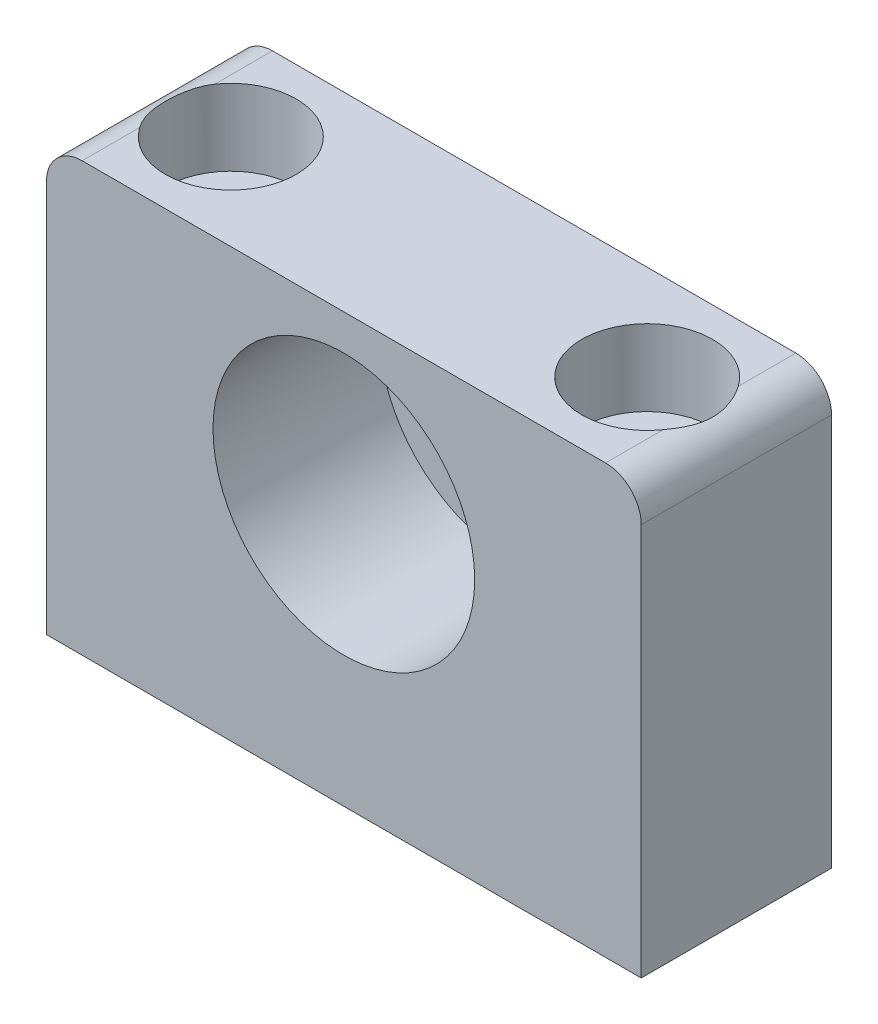
ISO-10303-21;
HEADER;
FILE_DESCRIPTION(('STEP AP214'),'2;1');
FILE_NAME('part.step','',(''),(''),'','','');
FILE_SCHEMA(('AUTOMOTIVE_DESIGN { 1 0 10303 214 1 1 1 1 }'));
ENDSEC;
DATA;
#1=APPLICATION_CONTEXT('core data for automotive mechanical design processes');
#2=APPLICATION_PROTOCOL_DEFINITION('international standard','automotive_design',2000,#1);
#3=PRODUCT_CONTEXT('',#1,'mechanical');
#4=PRODUCT('Part','Part','',(#3));
#5=PRODUCT_RELATED_PRODUCT_CATEGORY('part','',(#4));
#6=PRODUCT_DEFINITION_FORMATION('','',#4);
#7=PRODUCT_DEFINITION_CONTEXT('part definition',#1,'design');
#8=PRODUCT_DEFINITION('design','',#6,#7);
#9=PRODUCT_DEFINITION_SHAPE('','',#8);
#10=(LENGTH_UNIT() NAMED_UNIT(*) SI_UNIT(.MILLI.,.METRE.));
#11=(NAMED_UNIT(*) PLANE_ANGLE_UNIT() SI_UNIT($,.RADIAN.));
#12=(NAMED_UNIT(*) SI_UNIT($,.STERADIAN.) SOLID_ANGLE_UNIT());
#13=UNCERTAINTY_MEASURE_WITH_UNIT(LENGTH_MEASURE(1.E-05),#10,'distance_accuracy_value','');
#14=(GEOMETRIC_REPRESENTATION_CONTEXT(3) GLOBAL_UNCERTAINTY_ASSIGNED_CONTEXT((#13)) GLOBAL_UNIT_ASSIGNED_CONTEXT((#10,
#11,#12)) REPRESENTATION_CONTEXT('',''));
#15=CARTESIAN_POINT('',(0.,0.,0.));
#16=DIRECTION('',(0.,0.,1.));
#17=DIRECTION('',(1.,0.,0.));
#18=AXIS2_PLACEMENT_3D('',#15,#16,#17);
#19=CARTESIAN_POINT('',(22.,15.,-16.));
#20=DIRECTION('',(0.,0.,1.));
#21=DIRECTION('',(1.,0.,0.));
#22=AXIS2_PLACEMENT_3D('',#19,#20,#21);
#23=CYLINDRICAL_SURFACE('',#22,3.);
#24=CARTESIAN_POINT('',(22.,18.,-4.83772233983161));
#25=CARTESIAN_POINT('',(22.0728936167594,17.999979837649,-4.94143600714653));
#26=CARTESIAN_POINT('',(22.1421562820881,17.997343880009,-5.04763603602669));
#27=CARTESIAN_POINT('',(22.2730846538277,17.9882701175953,-5.26437326741168));
#28=CARTESIAN_POINT('',(22.3347555390714,17.9818349220855,-5.37490744468958));
#29=CARTESIAN_POINT('',(22.4503916728607,17.9665719101051,-5.60006577322751));
#30=CARTESIAN_POINT('',(22.504339875423,17.957738921763,-5.71469829478746));
#31=CARTESIAN_POINT('',(22.6041843917454,17.9389698170977,-5.94736012643152));
#32=CARTESIAN_POINT('',(22.6500785371519,17.9290334048772,-6.06539034133437));
#33=CARTESIAN_POINT('',(22.7406822361734,17.9075613642125,-6.32454770950639));
#34=CARTESIAN_POINT('',(22.7838807716316,17.8960392662533,-6.4662071446967));
#35=CARTESIAN_POINT('',(22.8587402045197,17.8747315946585,-6.75267459855691));
#36=CARTESIAN_POINT('',(22.8904008652707,17.8649460566474,-6.89748268175113));
#37=CARTESIAN_POINT('',(22.9419117863546,17.8484268822776,-7.18914263549887));
#38=CARTESIAN_POINT('',(22.9617795722639,17.841688720731,-7.33599113966526));
#39=CARTESIAN_POINT('',(22.989602362062,17.8321202777994,-7.6309388101264));
#40=CARTESIAN_POINT('',(22.997557766555,17.8292898650001,-7.77903793419532));
#41=CARTESIAN_POINT('',(23.0015160346607,17.8278917656304,-8.07819246731801));
#42=CARTESIAN_POINT('',(22.997292390815,17.8294048577736,-8.22925132516439));
#43=CARTESIAN_POINT('',(22.9764450972192,17.8366661210923,-8.53041014152259));
#44=CARTESIAN_POINT('',(22.9598208418199,17.8424144991203,-8.68051005283806));
#45=CARTESIAN_POINT('',(22.9142909293489,17.8573841868594,-8.97891553023976));
#46=CARTESIAN_POINT('',(22.8853641850986,17.8666114564956,-9.1272175636622));
#47=CARTESIAN_POINT('',(22.8154599162676,17.8872739591626,-9.42079412227537));
#48=CARTESIAN_POINT('',(22.7744822443742,17.8987092191837,-9.5660686104336));
#49=CARTESIAN_POINT('',(22.6853840217452,17.9209827080849,-9.83854870088488));
#50=CARTESIAN_POINT('',(22.638368828337,17.9317683383269,-9.96612167224252));
#51=CARTESIAN_POINT('',(22.535003955041,17.9523795451374,-10.2174756089013));
#52=CARTESIAN_POINT('',(22.4786566479798,17.9622053647448,-10.341257528677));
#53=CARTESIAN_POINT('',(22.3569922205916,17.9793172469696,-10.5841877796405));
#54=CARTESIAN_POINT('',(22.2916953362857,17.9866089116947,-10.7033458074251));
#55=CARTESIAN_POINT('',(22.1523335327881,17.9969383900761,-10.9367179139046));
#56=CARTESIAN_POINT('',(22.0782622890537,17.9999731148551,-11.0509283444011));
#57=CARTESIAN_POINT('',(22.,18.,-11.1622776601684));
#58=B_SPLINE_CURVE_WITH_KNOTS('',3,(#24,#25,#26,#27,#28,#29,#30,#31,#32,#33,#34,#35,#36,#37,#38,
#39,#40,#41,#42,#43,#44,#45,#46,#47,#48,#49,#50,#51,#52,#53,#54,#55,#56,#57),.UNSPECIFIED.,.F.,
.F.,(4,2,2,2,2,2,2,2,2,2,2,2,2,2,2,2,4),(0.,0.38012451694722,0.759988272840533,1.14067796951833,
1.52147000067337,1.96661678495802,2.41177270011759,2.85626539491175,3.30074314142183,
3.75354035080247,4.20635967637009,4.6599583086187,5.11356248596904,5.52236129187808,
5.93105631383874,6.33884202341364,6.74692347349995),.UNSPECIFIED.);
#59=CARTESIAN_POINT('',(22.,18.,-4.83772233983161));
#60=VERTEX_POINT('',#59);
#61=CARTESIAN_POINT('',(22.,18.,-11.1622776601684));
#62=VERTEX_POINT('',#61);
#63=EDGE_CURVE('E53',#60,#62,#58,.T.);
#64=ORIENTED_EDGE('',*,*,#63,.F.);
#65=DIRECTION('',(0.,0.,1.));
#66=VECTOR('',#65,1.);
#67=CARTESIAN_POINT('',(22.,18.,-16.));
#68=LINE('',#67,#66);
#69=CARTESIAN_POINT('',(22.,18.,0.));
#70=VERTEX_POINT('',#69);
#71=EDGE_CURVE('E129',#60,#70,#68,.T.);
#72=ORIENTED_EDGE('',*,*,#71,.T.);
#73=CARTESIAN_POINT('',(22.,15.,0.));
#74=DIRECTION('',(0.,0.,1.));
#75=DIRECTION('',(-1.,0.,0.));
#76=AXIS2_PLACEMENT_3D('',#73,#74,#75);
#77=CIRCLE('',#76,3.);
#78=CARTESIAN_POINT('',(25.,15.,0.));
#79=VERTEX_POINT('',#78);
#80=EDGE_CURVE('E201',#79,#70,#77,.T.);
#81=ORIENTED_EDGE('',*,*,#80,.F.);
#82=DIRECTION('',(0.,0.,1.));
#83=VECTOR('',#82,1.);
#84=CARTESIAN_POINT('',(25.,15.,-16.));
#85=LINE('',#84,#83);
#86=CARTESIAN_POINT('',(25.,15.,-16.));
#87=VERTEX_POINT('',#86);
#88=EDGE_CURVE('E138',#87,#79,#85,.T.);
#89=ORIENTED_EDGE('',*,*,#88,.F.);
#90=CARTESIAN_POINT('',(22.,15.,-16.));
#91=DIRECTION('',(0.,0.,1.));
#92=DIRECTION('',(-1.,0.,0.));
#93=AXIS2_PLACEMENT_3D('',#90,#91,#92);
#94=CIRCLE('',#93,3.);
#95=CARTESIAN_POINT('',(22.,18.,-16.));
#96=VERTEX_POINT('',#95);
#97=EDGE_CURVE('E215',#87,#96,#94,.T.);
#98=ORIENTED_EDGE('',*,*,#97,.T.);
#99=EDGE_CURVE('E125',#96,#62,#68,.T.);
#100=ORIENTED_EDGE('',*,*,#99,.T.);
#101=EDGE_LOOP('',(#64,#72,#81,#89,#98,#100));
#102=FACE_BOUND('',#101,.T.);
#103=ADVANCED_FACE('F39',(#102),#23,.T.);
#104=CARTESIAN_POINT('',(25.,15.,-16.));
#105=DIRECTION('',(1.,0.,0.));
#106=DIRECTION('',(0.,1.,0.));
#107=AXIS2_PLACEMENT_3D('',#104,#105,#106);
#108=PLANE('',#107);
#109=DIRECTION('',(0.,1.,0.));
#110=VECTOR('',#109,1.);
#111=CARTESIAN_POINT('',(25.,15.,0.));
#112=LINE('',#111,#110);
#113=CARTESIAN_POINT('',(25.,-18.,0.));
#114=VERTEX_POINT('',#113);
#115=EDGE_CURVE('E212',#114,#79,#112,.T.);
#116=ORIENTED_EDGE('',*,*,#115,.F.);
#117=DIRECTION('',(0.,0.,1.));
#118=VECTOR('',#117,1.);
#119=CARTESIAN_POINT('',(25.,-18.,-16.));
#120=LINE('',#119,#118);
#121=CARTESIAN_POINT('',(25.,-18.,-16.));
#122=VERTEX_POINT('',#121);
#123=EDGE_CURVE('E217',#122,#114,#120,.T.);
#124=ORIENTED_EDGE('',*,*,#123,.F.);
#125=DIRECTION('',(0.,1.,0.));
#126=VECTOR('',#125,1.);
#127=CARTESIAN_POINT('',(25.,15.,-16.));
#128=LINE('',#127,#126);
#129=EDGE_CURVE('E191',#122,#87,#128,.T.);
#130=ORIENTED_EDGE('',*,*,#129,.T.);
#131=ORIENTED_EDGE('',*,*,#88,.T.);
#132=EDGE_LOOP('',(#116,#124,#130,#131));
#133=FACE_BOUND('',#132,.T.);
#134=ADVANCED_FACE('F166',(#133),#108,.T.);
#135=CARTESIAN_POINT('',(-25.,-18.,-16.));
#136=DIRECTION('',(0.,-1.,0.));
#137=DIRECTION('',(0.,0.,-1.));
#138=AXIS2_PLACEMENT_3D('',#135,#136,#137);
#139=PLANE('',#138);
#140=CARTESIAN_POINT('',(-17.5,-18.,-8.));
#141=DIRECTION('',(0.,1.,0.));
#142=DIRECTION('',(0.,0.,1.));
#143=AXIS2_PLACEMENT_3D('',#140,#141,#142);
#144=CIRCLE('',#143,3.29999999999999);
#145=CARTESIAN_POINT('',(-17.5,-18.,-4.70000000000001));
#146=VERTEX_POINT('',#145);
#147=EDGE_CURVE('E249',#146,#146,#144,.T.);
#148=ORIENTED_EDGE('',*,*,#147,.T.);
#149=EDGE_LOOP('',(#148));
#150=FACE_BOUND('',#149,.T.);
#151=CARTESIAN_POINT('',(17.5,-18.,-8.));
#152=DIRECTION('',(0.,1.,0.));
#153=DIRECTION('',(0.,0.,1.));
#154=AXIS2_PLACEMENT_3D('',#151,#152,#153);
#155=CIRCLE('',#154,3.29999999999999);
#156=CARTESIAN_POINT('',(17.5,-18.,-4.70000000000001));
#157=VERTEX_POINT('',#156);
#158=EDGE_CURVE('E203',#157,#157,#155,.T.);
#159=ORIENTED_EDGE('',*,*,#158,.T.);
#160=EDGE_LOOP('',(#159));
#161=FACE_BOUND('',#160,.T.);
#162=DIRECTION('',(1.,0.,0.));
#163=VECTOR('',#162,1.);
#164=CARTESIAN_POINT('',(-25.,-18.,0.));
#165=LINE('',#164,#163);
#166=CARTESIAN_POINT('',(-25.,-18.,0.));
#167=VERTEX_POINT('',#166);
#168=EDGE_CURVE('E209',#167,#114,#165,.T.);
#169=ORIENTED_EDGE('',*,*,#168,.F.);
#170=DIRECTION('',(0.,0.,1.));
#171=VECTOR('',#170,1.);
#172=CARTESIAN_POINT('',(-25.,-18.,-16.));
#173=LINE('',#172,#171);
#174=CARTESIAN_POINT('',(-25.,-18.,-16.));
#175=VERTEX_POINT('',#174);
#176=EDGE_CURVE('E218',#175,#167,#173,.T.);
#177=ORIENTED_EDGE('',*,*,#176,.F.);
#178=DIRECTION('',(1.,0.,0.));
#179=VECTOR('',#178,1.);
#180=CARTESIAN_POINT('',(-25.,-18.,-16.));
#181=LINE('',#180,#179);
#182=EDGE_CURVE('E193',#175,#122,#181,.T.);
#183=ORIENTED_EDGE('',*,*,#182,.T.);
#184=ORIENTED_EDGE('',*,*,#123,.T.);
#185=EDGE_LOOP('',(#169,#177,#183,#184));
#186=FACE_BOUND('',#185,.T.);
#187=ADVANCED_FACE('F169',(#150,#161,#186),#139,.T.);
#188=CARTESIAN_POINT('',(-25.,15.,-16.));
#189=DIRECTION('',(-1.,0.,0.));
#190=DIRECTION('',(0.,-1.,0.));
#191=AXIS2_PLACEMENT_3D('',#188,#189,#190);
#192=PLANE('',#191);
#193=DIRECTION('',(0.,-1.,0.));
#194=VECTOR('',#193,1.);
#195=CARTESIAN_POINT('',(-25.,15.,0.));
#196=LINE('',#195,#194);
#197=CARTESIAN_POINT('',(-25.,15.,0.));
#198=VERTEX_POINT('',#197);
#199=EDGE_CURVE('E206',#198,#167,#196,.T.);
#200=ORIENTED_EDGE('',*,*,#199,.F.);
#201=DIRECTION('',(0.,0.,1.));
#202=VECTOR('',#201,1.);
#203=CARTESIAN_POINT('',(-25.,15.,-16.));
#204=LINE('',#203,#202);
#205=CARTESIAN_POINT('',(-25.,15.,-16.));
#206=VERTEX_POINT('',#205);
#207=EDGE_CURVE('E127',#206,#198,#204,.T.);
#208=ORIENTED_EDGE('',*,*,#207,.F.);
#209=DIRECTION('',(0.,-1.,0.));
#210=VECTOR('',#209,1.);
#211=CARTESIAN_POINT('',(-25.,15.,-16.));
#212=LINE('',#211,#210);
#213=EDGE_CURVE('E197',#206,#175,#212,.T.);
#214=ORIENTED_EDGE('',*,*,#213,.T.);
#215=ORIENTED_EDGE('',*,*,#176,.T.);
#216=EDGE_LOOP('',(#200,#208,#214,#215));
#217=FACE_BOUND('',#216,.T.);
#218=ADVANCED_FACE('F173',(#217),#192,.T.);
#219=CARTESIAN_POINT('',(-22.,15.,-16.));
#220=DIRECTION('',(0.,0.,1.));
#221=DIRECTION('',(1.,0.,0.));
#222=AXIS2_PLACEMENT_3D('',#219,#220,#221);
#223=CYLINDRICAL_SURFACE('',#222,3.);
#224=CARTESIAN_POINT('',(-22.,18.,-11.1622776601684));
#225=CARTESIAN_POINT('',(-22.0728936167594,17.999979837649,-11.0585639928535));
#226=CARTESIAN_POINT('',(-22.1421562820881,17.997343880009,-10.9523639639733));
#227=CARTESIAN_POINT('',(-22.2730846538277,17.9882701175953,-10.7356267325883));
#228=CARTESIAN_POINT('',(-22.3347555390714,17.9818349220855,-10.6250925553104));
#229=CARTESIAN_POINT('',(-22.4503916728607,17.9665719101051,-10.3999342267725));
#230=CARTESIAN_POINT('',(-22.504339875423,17.957738921763,-10.2853017052125));
#231=CARTESIAN_POINT('',(-22.6041843917454,17.9389698170977,-10.0526398735685));
#232=CARTESIAN_POINT('',(-22.6500785371519,17.9290334048772,-9.93460965866563));
#233=CARTESIAN_POINT('',(-22.7406822361735,17.9075613642125,-9.6754522904936));
#234=CARTESIAN_POINT('',(-22.7838807716316,17.8960392662533,-9.53379285530329));
#235=CARTESIAN_POINT('',(-22.8587402045197,17.8747315946585,-9.24732540144308));
#236=CARTESIAN_POINT('',(-22.8904008652707,17.8649460566474,-9.10251731824886));
#237=CARTESIAN_POINT('',(-22.9419117863546,17.8484268822776,-8.81085736450112));
#238=CARTESIAN_POINT('',(-22.9617795722639,17.841688720731,-8.66400886033473));
#239=CARTESIAN_POINT('',(-22.989602362062,17.8321202777994,-8.36906118987358));
#240=CARTESIAN_POINT('',(-22.997557766555,17.8292898650001,-8.22096206580467));
#241=CARTESIAN_POINT('',(-23.0015160346607,17.8278917656304,-7.92180753268197));
#242=CARTESIAN_POINT('',(-22.997292390815,17.8294048577736,-7.7707486748356));
#243=CARTESIAN_POINT('',(-22.9764450972192,17.8366661210923,-7.4695898584774));
#244=CARTESIAN_POINT('',(-22.9598208418199,17.8424144991203,-7.31948994716193));
#245=CARTESIAN_POINT('',(-22.9142909293489,17.8573841868594,-7.02108446976023));
#246=CARTESIAN_POINT('',(-22.8853641850986,17.8666114564956,-6.87278243633779));
#247=CARTESIAN_POINT('',(-22.8154599162676,17.8872739591626,-6.57920587772462));
#248=CARTESIAN_POINT('',(-22.7744822443742,17.8987092191838,-6.43393138956639));
#249=CARTESIAN_POINT('',(-22.6853840217452,17.9209827080849,-6.16145129911512));
#250=CARTESIAN_POINT('',(-22.638368828337,17.9317683383269,-6.03387832775747));
#251=CARTESIAN_POINT('',(-22.535003955041,17.9523795451374,-5.7825243910987));
#252=CARTESIAN_POINT('',(-22.4786566479798,17.9622053647448,-5.65874247132304));
#253=CARTESIAN_POINT('',(-22.3569922205916,17.9793172469696,-5.41581222035949));
#254=CARTESIAN_POINT('',(-22.2916953362857,17.9866089116947,-5.29665419257489));
#255=CARTESIAN_POINT('',(-22.1523335327881,17.9969383900761,-5.06328208609537));
#256=CARTESIAN_POINT('',(-22.0782622890537,17.9999731148551,-4.94907165559895));
#257=CARTESIAN_POINT('',(-22.,18.,-4.83772233983162));
#258=B_SPLINE_CURVE_WITH_KNOTS('',3,(#224,#225,#226,#227,#228,#229,#230,#231,#232,#233,#234,
#235,#236,#237,#238,#239,#240,#241,#242,#243,#244,#245,#246,#247,#248,#249,#250,#251,#252,#253,
#254,#255,#256,#257),.UNSPECIFIED.,.F.,.F.,(4,2,2,2,2,2,2,2,2,2,2,2,2,2,2,2,4),(0.,
0.380124516947222,0.759988272840537,1.14067796951834,1.52147000067338,1.96661678495802,
2.41177270011759,2.85626539491176,3.30074314142183,3.75354035080248,4.20635967637009,
4.65995830861871,5.11356248596905,5.52236129187808,5.93105631383874,6.33884202341363,
6.74692347349994),.UNSPECIFIED.);
#259=CARTESIAN_POINT('',(-22.,18.,-11.1622776601684));
#260=VERTEX_POINT('',#259);
#261=CARTESIAN_POINT('',(-22.,18.,-4.83772233983162));
#262=VERTEX_POINT('',#261);
#263=EDGE_CURVE('E11',#260,#262,#258,.T.);
#264=ORIENTED_EDGE('',*,*,#263,.F.);
#265=DIRECTION('',(0.,0.,1.));
#266=VECTOR('',#265,1.);
#267=CARTESIAN_POINT('',(-22.,18.,-16.));
#268=LINE('',#267,#266);
#269=CARTESIAN_POINT('',(-22.,18.,-16.));
#270=VERTEX_POINT('',#269);
#271=EDGE_CURVE('E117',#270,#260,#268,.T.);
#272=ORIENTED_EDGE('',*,*,#271,.F.);
#273=CARTESIAN_POINT('',(-22.,15.,-16.));
#274=DIRECTION('',(0.,0.,1.));
#275=DIRECTION('',(1.,0.,0.));
#276=AXIS2_PLACEMENT_3D('',#273,#274,#275);
#277=CIRCLE('',#276,3.);
#278=EDGE_CURVE('E224',#270,#206,#277,.T.);
#279=ORIENTED_EDGE('',*,*,#278,.T.);
#280=ORIENTED_EDGE('',*,*,#207,.T.);
#281=CARTESIAN_POINT('',(-22.,15.,0.));
#282=DIRECTION('',(0.,0.,1.));
#283=DIRECTION('',(1.,0.,0.));
#284=AXIS2_PLACEMENT_3D('',#281,#282,#283);
#285=CIRCLE('',#284,3.);
#286=CARTESIAN_POINT('',(-22.,18.,0.));
#287=VERTEX_POINT('',#286);
#288=EDGE_CURVE('E123',#287,#198,#285,.T.);
#289=ORIENTED_EDGE('',*,*,#288,.F.);
#290=EDGE_CURVE('E114',#262,#287,#268,.T.);
#291=ORIENTED_EDGE('',*,*,#290,.F.);
#292=EDGE_LOOP('',(#264,#272,#279,#280,#289,#291));
#293=FACE_BOUND('',#292,.T.);
#294=ADVANCED_FACE('F121',(#293),#223,.T.);
#295=CARTESIAN_POINT('',(-22.,18.,-16.));
#296=DIRECTION('',(0.,1.,0.));
#297=DIRECTION('',(-1.,0.,0.));
#298=AXIS2_PLACEMENT_3D('',#295,#296,#297);
#299=PLANE('',#298);
#300=CARTESIAN_POINT('',(-17.5,18.,-8.));
#301=DIRECTION('',(0.,1.,0.));
#302=DIRECTION('',(0.,0.,1.));
#303=AXIS2_PLACEMENT_3D('',#300,#301,#302);
#304=CIRCLE('',#303,5.5);
#305=EDGE_CURVE('E58',#262,#260,#304,.T.);
#306=ORIENTED_EDGE('',*,*,#305,.F.);
#307=ORIENTED_EDGE('',*,*,#290,.T.);
#308=DIRECTION('',(-1.,0.,0.));
#309=VECTOR('',#308,1.);
#310=CARTESIAN_POINT('',(-22.,18.,0.));
#311=LINE('',#310,#309);
#312=EDGE_CURVE('E189',#70,#287,#311,.T.);
#313=ORIENTED_EDGE('',*,*,#312,.F.);
#314=ORIENTED_EDGE('',*,*,#71,.F.);
#315=CARTESIAN_POINT('',(17.5,18.,-8.));
#316=DIRECTION('',(0.,1.,0.));
#317=DIRECTION('',(0.,0.,1.));
#318=AXIS2_PLACEMENT_3D('',#315,#316,#317);
#319=CIRCLE('',#318,5.5);
#320=EDGE_CURVE('E65',#62,#60,#319,.T.);
#321=ORIENTED_EDGE('',*,*,#320,.F.);
#322=ORIENTED_EDGE('',*,*,#99,.F.);
#323=DIRECTION('',(-1.,0.,0.));
#324=VECTOR('',#323,1.);
#325=CARTESIAN_POINT('',(-22.,18.,-16.));
#326=LINE('',#325,#324);
#327=EDGE_CURVE('E231',#96,#270,#326,.T.);
#328=ORIENTED_EDGE('',*,*,#327,.T.);
#329=ORIENTED_EDGE('',*,*,#271,.T.);
#330=EDGE_LOOP('',(#306,#307,#313,#314,#321,#322,#328,#329));
#331=FACE_BOUND('',#330,.T.);
#332=ADVANCED_FACE('F112',(#331),#299,.T.);
#333=CARTESIAN_POINT('',(22.,15.,-16.));
#334=DIRECTION('',(0.,0.,-1.));
#335=DIRECTION('',(-1.,0.,0.));
#336=AXIS2_PLACEMENT_3D('',#333,#334,#335);
#337=PLANE('',#336);
#338=ORIENTED_EDGE('',*,*,#97,.F.);
#339=ORIENTED_EDGE('',*,*,#129,.F.);
#340=ORIENTED_EDGE('',*,*,#182,.F.);
#341=ORIENTED_EDGE('',*,*,#213,.F.);
#342=ORIENTED_EDGE('',*,*,#278,.F.);
#343=ORIENTED_EDGE('',*,*,#327,.F.);
#344=EDGE_LOOP('',(#338,#339,#340,#341,#342,#343));
#345=FACE_BOUND('',#344,.T.);
#346=ADVANCED_FACE('F159',(#345),#337,.T.);
#347=CARTESIAN_POINT('',(22.,15.,0.));
#348=DIRECTION('',(0.,0.,-1.));
#349=DIRECTION('',(-1.,0.,0.));
#350=AXIS2_PLACEMENT_3D('',#347,#348,#349);
#351=PLANE('',#350);
#352=CARTESIAN_POINT('',(0.,4.,0.));
#353=DIRECTION('',(0.,0.,1.));
#354=DIRECTION('',(1.,0.,0.));
#355=AXIS2_PLACEMENT_3D('',#352,#353,#354);
#356=CIRCLE('',#355,11.);
#357=CARTESIAN_POINT('',(11.,4.,0.));
#358=VERTEX_POINT('',#357);
#359=EDGE_CURVE('E260',#358,#358,#356,.T.);
#360=ORIENTED_EDGE('',*,*,#359,.F.);
#361=EDGE_LOOP('',(#360));
#362=FACE_BOUND('',#361,.T.);
#363=ORIENTED_EDGE('',*,*,#80,.T.);
#364=ORIENTED_EDGE('',*,*,#312,.T.);
#365=ORIENTED_EDGE('',*,*,#288,.T.);
#366=ORIENTED_EDGE('',*,*,#199,.T.);
#367=ORIENTED_EDGE('',*,*,#168,.T.);
#368=ORIENTED_EDGE('',*,*,#115,.T.);
#369=EDGE_LOOP('',(#363,#364,#365,#366,#367,#368));
#370=FACE_BOUND('',#369,.T.);
#371=ADVANCED_FACE('F157',(#362,#370),#351,.F.);
#372=CARTESIAN_POINT('',(17.5,18.,-8.));
#373=DIRECTION('',(0.,1.,0.));
#374=DIRECTION('',(0.,0.,1.));
#375=AXIS2_PLACEMENT_3D('',#372,#373,#374);
#376=CYLINDRICAL_SURFACE('',#375,3.29999999999999);
#377=ORIENTED_EDGE('',*,*,#158,.F.);
#378=EDGE_LOOP('',(#377));
#379=FACE_BOUND('',#378,.T.);
#380=CARTESIAN_POINT('',(17.5,11.575,-8.));
#381=DIRECTION('',(0.,1.,0.));
#382=DIRECTION('',(0.,0.,1.));
#383=AXIS2_PLACEMENT_3D('',#380,#381,#382);
#384=CIRCLE('',#383,3.3);
#385=CARTESIAN_POINT('',(17.5,11.575,-4.7));
#386=VERTEX_POINT('',#385);
#387=EDGE_CURVE('E239',#386,#386,#384,.T.);
#388=ORIENTED_EDGE('',*,*,#387,.T.);
#389=EDGE_LOOP('',(#388));
#390=FACE_BOUND('',#389,.T.);
#391=ADVANCED_FACE('F153',(#379,#390),#376,.F.);
#392=CARTESIAN_POINT('',(17.5,11.6,-8.));
#393=DIRECTION('',(0.,1.,0.));
#394=DIRECTION('',(0.,0.,1.));
#395=AXIS2_PLACEMENT_3D('',#392,#393,#394);
#396=CONICAL_SURFACE('',#395,3.325,0.785398163397483);
#397=ORIENTED_EDGE('',*,*,#387,.F.);
#398=EDGE_LOOP('',(#397));
#399=FACE_BOUND('',#398,.T.);
#400=CARTESIAN_POINT('',(17.5,11.6,-8.));
#401=DIRECTION('',(0.,1.,0.));
#402=DIRECTION('',(0.,0.,1.));
#403=AXIS2_PLACEMENT_3D('',#400,#401,#402);
#404=CIRCLE('',#403,3.325);
#405=CARTESIAN_POINT('',(17.5,11.6,-4.675));
#406=VERTEX_POINT('',#405);
#407=EDGE_CURVE('E242',#406,#406,#404,.T.);
#408=ORIENTED_EDGE('',*,*,#407,.T.);
#409=EDGE_LOOP('',(#408));
#410=FACE_BOUND('',#409,.T.);
#411=ADVANCED_FACE('F149',(#399,#410),#396,.F.);
#412=CARTESIAN_POINT('',(20.825,11.6,-8.));
#413=DIRECTION('',(0.,-1.,0.));
#414=DIRECTION('',(0.,0.,-1.));
#415=AXIS2_PLACEMENT_3D('',#412,#413,#414);
#416=PLANE('',#415);
#417=ORIENTED_EDGE('',*,*,#407,.F.);
#418=EDGE_LOOP('',(#417));
#419=FACE_BOUND('',#418,.T.);
#420=CARTESIAN_POINT('',(17.5,11.6,-8.));
#421=DIRECTION('',(0.,1.,0.));
#422=DIRECTION('',(0.,0.,1.));
#423=AXIS2_PLACEMENT_3D('',#420,#421,#422);
#424=CIRCLE('',#423,5.5);
#425=CARTESIAN_POINT('',(17.5,11.6,-2.5));
#426=VERTEX_POINT('',#425);
#427=EDGE_CURVE('E245',#426,#426,#424,.T.);
#428=ORIENTED_EDGE('',*,*,#427,.T.);
#429=EDGE_LOOP('',(#428));
#430=FACE_BOUND('',#429,.T.);
#431=ADVANCED_FACE('F145',(#419,#430),#416,.F.);
#432=CARTESIAN_POINT('',(17.5,18.,-8.));
#433=DIRECTION('',(0.,1.,0.));
#434=DIRECTION('',(0.,0.,1.));
#435=AXIS2_PLACEMENT_3D('',#432,#433,#434);
#436=CYLINDRICAL_SURFACE('',#435,5.5);
#437=ORIENTED_EDGE('',*,*,#63,.T.);
#438=ORIENTED_EDGE('',*,*,#320,.T.);
#439=EDGE_LOOP('',(#437,#438));
#440=FACE_BOUND('',#439,.T.);
#441=ORIENTED_EDGE('',*,*,#427,.F.);
#442=EDGE_LOOP('',(#441));
#443=FACE_BOUND('',#442,.T.);
#444=ADVANCED_FACE('F139',(#440,#443),#436,.F.);
#445=CARTESIAN_POINT('',(-17.5,18.,-8.));
#446=DIRECTION('',(0.,1.,0.));
#447=DIRECTION('',(0.,0.,1.));
#448=AXIS2_PLACEMENT_3D('',#445,#446,#447);
#449=CYLINDRICAL_SURFACE('',#448,3.29999999999999);
#450=ORIENTED_EDGE('',*,*,#147,.F.);
#451=EDGE_LOOP('',(#450));
#452=FACE_BOUND('',#451,.T.);
#453=CARTESIAN_POINT('',(-17.5,11.575,-8.));
#454=DIRECTION('',(0.,1.,0.));
#455=DIRECTION('',(0.,0.,1.));
#456=AXIS2_PLACEMENT_3D('',#453,#454,#455);
#457=CIRCLE('',#456,3.3);
#458=CARTESIAN_POINT('',(-17.5,11.575,-4.7));
#459=VERTEX_POINT('',#458);
#460=EDGE_CURVE('E252',#459,#459,#457,.T.);
#461=ORIENTED_EDGE('',*,*,#460,.T.);
#462=EDGE_LOOP('',(#461));
#463=FACE_BOUND('',#462,.T.);
#464=ADVANCED_FACE('F144',(#452,#463),#449,.F.);
#465=CARTESIAN_POINT('',(-17.5,11.6,-8.));
#466=DIRECTION('',(0.,1.,0.));
#467=DIRECTION('',(0.,0.,1.));
#468=AXIS2_PLACEMENT_3D('',#465,#466,#467);
#469=CONICAL_SURFACE('',#468,3.325,0.785398163397448);
#470=ORIENTED_EDGE('',*,*,#460,.F.);
#471=EDGE_LOOP('',(#470));
#472=FACE_BOUND('',#471,.T.);
#473=CARTESIAN_POINT('',(-17.5,11.6,-8.));
#474=DIRECTION('',(0.,1.,0.));
#475=DIRECTION('',(0.,0.,1.));
#476=AXIS2_PLACEMENT_3D('',#473,#474,#475);
#477=CIRCLE('',#476,3.325);
#478=CARTESIAN_POINT('',(-17.5,11.6,-4.675));
#479=VERTEX_POINT('',#478);
#480=EDGE_CURVE('E255',#479,#479,#477,.T.);
#481=ORIENTED_EDGE('',*,*,#480,.T.);
#482=EDGE_LOOP('',(#481));
#483=FACE_BOUND('',#482,.T.);
#484=ADVANCED_FACE('F282',(#472,#483),#469,.F.);
#485=CARTESIAN_POINT('',(-14.175,11.6,-8.));
#486=DIRECTION('',(0.,-1.,0.));
#487=DIRECTION('',(0.,0.,-1.));
#488=AXIS2_PLACEMENT_3D('',#485,#486,#487);
#489=PLANE('',#488);
#490=ORIENTED_EDGE('',*,*,#480,.F.);
#491=EDGE_LOOP('',(#490));
#492=FACE_BOUND('',#491,.T.);
#493=CARTESIAN_POINT('',(-17.5,11.6,-8.));
#494=DIRECTION('',(0.,1.,0.));
#495=DIRECTION('',(0.,0.,1.));
#496=AXIS2_PLACEMENT_3D('',#493,#494,#495);
#497=CIRCLE('',#496,5.5);
#498=CARTESIAN_POINT('',(-17.5,11.6,-2.5));
#499=VERTEX_POINT('',#498);
#500=EDGE_CURVE('E118',#499,#499,#497,.T.);
#501=ORIENTED_EDGE('',*,*,#500,.T.);
#502=EDGE_LOOP('',(#501));
#503=FACE_BOUND('',#502,.T.);
#504=ADVANCED_FACE('F278',(#492,#503),#489,.F.);
#505=CARTESIAN_POINT('',(-17.5,18.,-8.));
#506=DIRECTION('',(0.,1.,0.));
#507=DIRECTION('',(0.,0.,1.));
#508=AXIS2_PLACEMENT_3D('',#505,#506,#507);
#509=CYLINDRICAL_SURFACE('',#508,5.5);
#510=ORIENTED_EDGE('',*,*,#263,.T.);
#511=ORIENTED_EDGE('',*,*,#305,.T.);
#512=EDGE_LOOP('',(#510,#511));
#513=FACE_BOUND('',#512,.T.);
#514=ORIENTED_EDGE('',*,*,#500,.F.);
#515=EDGE_LOOP('',(#514));
#516=FACE_BOUND('',#515,.T.);
#517=ADVANCED_FACE('F106',(#513,#516),#509,.F.);
#518=CARTESIAN_POINT('',(0.,4.,-14.));
#519=DIRECTION('',(0.,0.,1.));
#520=DIRECTION('',(1.,0.,0.));
#521=AXIS2_PLACEMENT_3D('',#518,#519,#520);
#522=CYLINDRICAL_SURFACE('',#521,11.);
#523=CARTESIAN_POINT('',(0.,4.,-14.));
#524=DIRECTION('',(0.,0.,1.));
#525=DIRECTION('',(1.,0.,0.));
#526=AXIS2_PLACEMENT_3D('',#523,#524,#525);
#527=CIRCLE('',#526,11.);
#528=CARTESIAN_POINT('',(11.,4.,-14.));
#529=VERTEX_POINT('',#528);
#530=EDGE_CURVE('E119',#529,#529,#527,.T.);
#531=ORIENTED_EDGE('',*,*,#530,.F.);
#532=EDGE_LOOP('',(#531));
#533=FACE_BOUND('',#532,.T.);
#534=ORIENTED_EDGE('',*,*,#359,.T.);
#535=EDGE_LOOP('',(#534));
#536=FACE_BOUND('',#535,.T.);
#537=ADVANCED_FACE('F268',(#533,#536),#522,.F.);
#538=CARTESIAN_POINT('',(0.,4.,-14.));
#539=DIRECTION('',(0.,0.,1.));
#540=DIRECTION('',(1.,0.,0.));
#541=AXIS2_PLACEMENT_3D('',#538,#539,#540);
#542=PLANE('',#541);
#543=ORIENTED_EDGE('',*,*,#530,.T.);
#544=EDGE_LOOP('',(#543));
#545=FACE_BOUND('',#544,.T.);
#546=ADVANCED_FACE('F266',(#545),#542,.T.);
#547=CLOSED_SHELL('',(#103,#134,#187,#218,#294,#332,#346,#371,#391,#411,#431,#444,#464,#484,
#504,#517,#537,#546));
#548=MANIFOLD_SOLID_BREP('B2',#547);
#549=ADVANCED_BREP_SHAPE_REPRESENTATION('',(#18,#548),#14);
#550=SHAPE_DEFINITION_REPRESENTATION(#9,#549);
ENDSEC;
END-ISO-10303-21;
